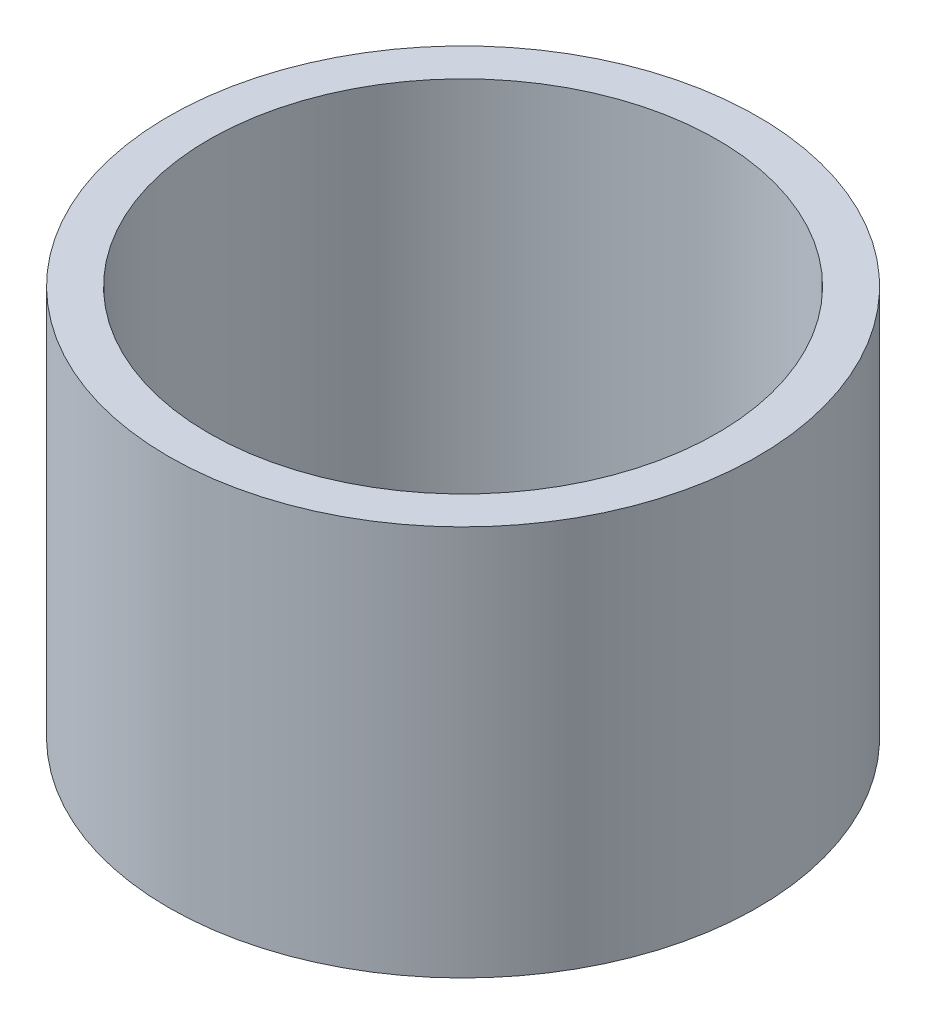
ISO-10303-21;
HEADER;
FILE_DESCRIPTION(('STEP AP214'),'2;1');
FILE_NAME('part.step','',(''),(''),'','','');
FILE_SCHEMA(('AUTOMOTIVE_DESIGN { 1 0 10303 214 1 1 1 1 }'));
ENDSEC;
DATA;
#1=APPLICATION_CONTEXT('core data for automotive mechanical design processes');
#2=APPLICATION_PROTOCOL_DEFINITION('international standard','automotive_design',2000,#1);
#3=PRODUCT_CONTEXT('',#1,'mechanical');
#4=PRODUCT('Part','Part','',(#3));
#5=PRODUCT_RELATED_PRODUCT_CATEGORY('part','',(#4));
#6=PRODUCT_DEFINITION_FORMATION('','',#4);
#7=PRODUCT_DEFINITION_CONTEXT('part definition',#1,'design');
#8=PRODUCT_DEFINITION('design','',#6,#7);
#9=PRODUCT_DEFINITION_SHAPE('','',#8);
#10=(LENGTH_UNIT() NAMED_UNIT(*) SI_UNIT(.MILLI.,.METRE.));
#11=(NAMED_UNIT(*) PLANE_ANGLE_UNIT() SI_UNIT($,.RADIAN.));
#12=(NAMED_UNIT(*) SI_UNIT($,.STERADIAN.) SOLID_ANGLE_UNIT());
#13=UNCERTAINTY_MEASURE_WITH_UNIT(LENGTH_MEASURE(1.E-05),#10,'distance_accuracy_value','');
#14=(GEOMETRIC_REPRESENTATION_CONTEXT(3) GLOBAL_UNCERTAINTY_ASSIGNED_CONTEXT((#13)) GLOBAL_UNIT_ASSIGNED_CONTEXT((#10,
#11,#12)) REPRESENTATION_CONTEXT('',''));
#15=CARTESIAN_POINT('',(0.,0.,0.));
#16=DIRECTION('',(0.,0.,1.));
#17=DIRECTION('',(1.,0.,0.));
#18=AXIS2_PLACEMENT_3D('',#15,#16,#17);
#19=CARTESIAN_POINT('',(0.,6.3,0.));
#20=DIRECTION('',(0.,1.,0.));
#21=DIRECTION('',(0.,0.,1.));
#22=AXIS2_PLACEMENT_3D('',#19,#20,#21);
#23=PLANE('',#22);
#24=CARTESIAN_POINT('',(0.,6.3,0.));
#25=DIRECTION('',(0.,1.,0.));
#26=DIRECTION('',(0.,0.,1.));
#27=AXIS2_PLACEMENT_3D('',#24,#25,#26);
#28=CIRCLE('',#27,4.75);
#29=CARTESIAN_POINT('',(0.,6.3,4.75));
#30=VERTEX_POINT('',#29);
#31=EDGE_CURVE('E10',#30,#30,#28,.T.);
#32=ORIENTED_EDGE('',*,*,#31,.T.);
#33=EDGE_LOOP('',(#32));
#34=FACE_BOUND('',#33,.T.);
#35=CARTESIAN_POINT('',(0.,6.3,0.));
#36=DIRECTION('',(0.,1.,0.));
#37=DIRECTION('',(0.,0.,1.));
#38=AXIS2_PLACEMENT_3D('',#35,#36,#37);
#39=CIRCLE('',#38,4.1);
#40=CARTESIAN_POINT('',(0.,6.3,4.1));
#41=VERTEX_POINT('',#40);
#42=EDGE_CURVE('E61',#41,#41,#39,.T.);
#43=ORIENTED_EDGE('',*,*,#42,.F.);
#44=EDGE_LOOP('',(#43));
#45=FACE_BOUND('',#44,.T.);
#46=ADVANCED_FACE('F45',(#34,#45),#23,.T.);
#47=CARTESIAN_POINT('',(0.,0.,0.));
#48=DIRECTION('',(0.,1.,0.));
#49=DIRECTION('',(0.,0.,1.));
#50=AXIS2_PLACEMENT_3D('',#47,#48,#49);
#51=PLANE('',#50);
#52=CARTESIAN_POINT('',(0.,0.,0.));
#53=DIRECTION('',(0.,1.,0.));
#54=DIRECTION('',(0.,0.,1.));
#55=AXIS2_PLACEMENT_3D('',#52,#53,#54);
#56=CIRCLE('',#55,4.75);
#57=CARTESIAN_POINT('',(0.,0.,4.75));
#58=VERTEX_POINT('',#57);
#59=EDGE_CURVE('E49',#58,#58,#56,.T.);
#60=ORIENTED_EDGE('',*,*,#59,.F.);
#61=EDGE_LOOP('',(#60));
#62=FACE_BOUND('',#61,.T.);
#63=CARTESIAN_POINT('',(0.,0.,0.));
#64=DIRECTION('',(0.,1.,0.));
#65=DIRECTION('',(0.,0.,1.));
#66=AXIS2_PLACEMENT_3D('',#63,#64,#65);
#67=CIRCLE('',#66,4.1);
#68=CARTESIAN_POINT('',(0.,0.,4.1));
#69=VERTEX_POINT('',#68);
#70=EDGE_CURVE('E63',#69,#69,#67,.T.);
#71=ORIENTED_EDGE('',*,*,#70,.T.);
#72=EDGE_LOOP('',(#71));
#73=FACE_BOUND('',#72,.T.);
#74=ADVANCED_FACE('F74',(#62,#73),#51,.F.);
#75=CARTESIAN_POINT('',(0.,6.3,0.));
#76=DIRECTION('',(0.,-1.,0.));
#77=DIRECTION('',(0.,0.,-1.));
#78=AXIS2_PLACEMENT_3D('',#75,#76,#77);
#79=CYLINDRICAL_SURFACE('',#78,4.75);
#80=ORIENTED_EDGE('',*,*,#31,.F.);
#81=EDGE_LOOP('',(#80));
#82=FACE_BOUND('',#81,.T.);
#83=ORIENTED_EDGE('',*,*,#59,.T.);
#84=EDGE_LOOP('',(#83));
#85=FACE_BOUND('',#84,.T.);
#86=ADVANCED_FACE('F47',(#82,#85),#79,.T.);
#87=CARTESIAN_POINT('',(0.,6.3,0.));
#88=DIRECTION('',(0.,-1.,0.));
#89=DIRECTION('',(0.,0.,-1.));
#90=AXIS2_PLACEMENT_3D('',#87,#88,#89);
#91=CYLINDRICAL_SURFACE('',#90,4.1);
#92=ORIENTED_EDGE('',*,*,#42,.T.);
#93=EDGE_LOOP('',(#92));
#94=FACE_BOUND('',#93,.T.);
#95=ORIENTED_EDGE('',*,*,#70,.F.);
#96=EDGE_LOOP('',(#95));
#97=FACE_BOUND('',#96,.T.);
#98=ADVANCED_FACE('F70',(#94,#97),#91,.F.);
#99=CLOSED_SHELL('',(#46,#74,#86,#98));
#100=MANIFOLD_SOLID_BREP('B2',#99);
#101=ADVANCED_BREP_SHAPE_REPRESENTATION('',(#18,#100),#14);
#102=SHAPE_DEFINITION_REPRESENTATION(#9,#101);
ENDSEC;
END-ISO-10303-21;
